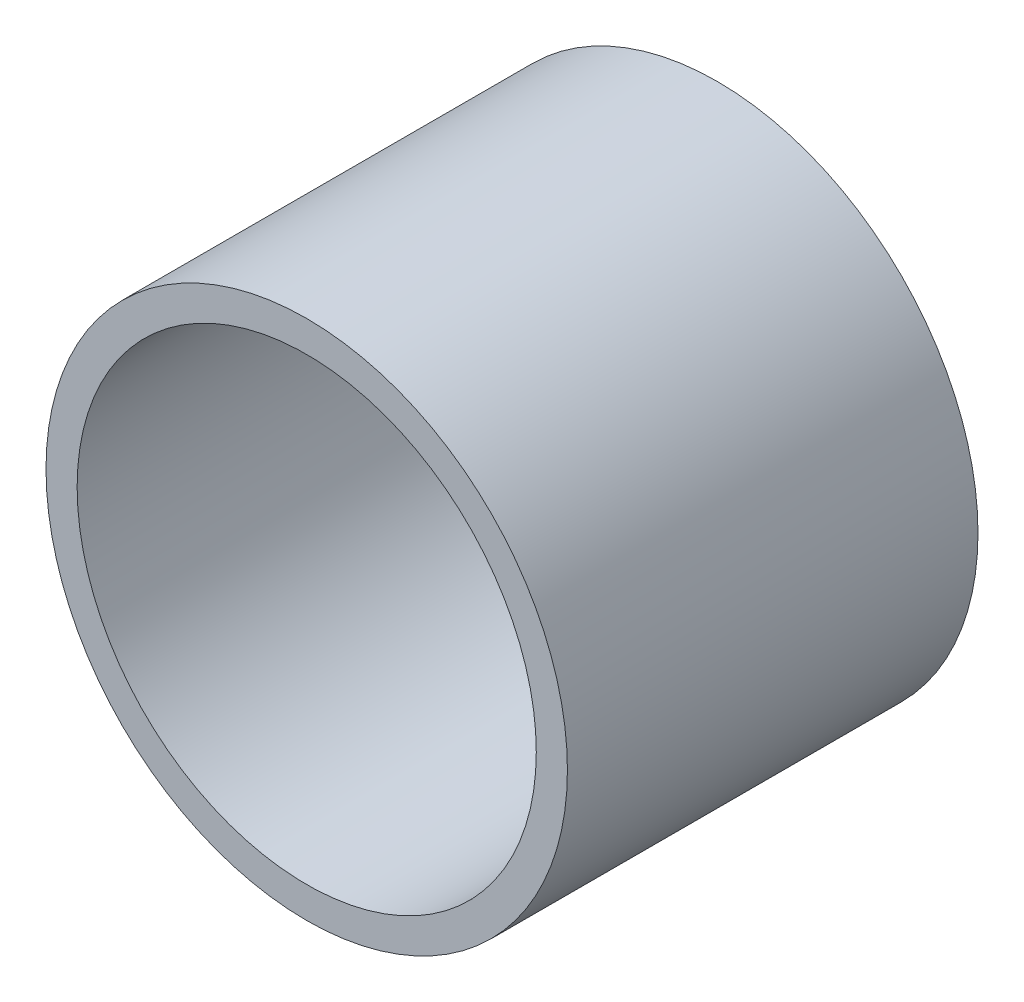
ISO-10303-21;
HEADER;
FILE_DESCRIPTION(('STEP AP214'),'2;1');
FILE_NAME('part.step','',(''),(''),'','','');
FILE_SCHEMA(('AUTOMOTIVE_DESIGN { 1 0 10303 214 1 1 1 1 }'));
ENDSEC;
DATA;
#1=APPLICATION_CONTEXT('core data for automotive mechanical design processes');
#2=APPLICATION_PROTOCOL_DEFINITION('international standard','automotive_design',2000,#1);
#3=PRODUCT_CONTEXT('',#1,'mechanical');
#4=PRODUCT('Part','Part','',(#3));
#5=PRODUCT_RELATED_PRODUCT_CATEGORY('part','',(#4));
#6=PRODUCT_DEFINITION_FORMATION('','',#4);
#7=PRODUCT_DEFINITION_CONTEXT('part definition',#1,'design');
#8=PRODUCT_DEFINITION('design','',#6,#7);
#9=PRODUCT_DEFINITION_SHAPE('','',#8);
#10=(LENGTH_UNIT() NAMED_UNIT(*) SI_UNIT(.MILLI.,.METRE.));
#11=(NAMED_UNIT(*) PLANE_ANGLE_UNIT() SI_UNIT($,.RADIAN.));
#12=(NAMED_UNIT(*) SI_UNIT($,.STERADIAN.) SOLID_ANGLE_UNIT());
#13=UNCERTAINTY_MEASURE_WITH_UNIT(LENGTH_MEASURE(1.E-05),#10,'distance_accuracy_value','');
#14=(GEOMETRIC_REPRESENTATION_CONTEXT(3) GLOBAL_UNCERTAINTY_ASSIGNED_CONTEXT((#13)) GLOBAL_UNIT_ASSIGNED_CONTEXT((#10,
#11,#12)) REPRESENTATION_CONTEXT('',''));
#15=CARTESIAN_POINT('',(0.,0.,0.));
#16=DIRECTION('',(0.,0.,1.));
#17=DIRECTION('',(1.,0.,0.));
#18=AXIS2_PLACEMENT_3D('',#15,#16,#17);
#19=CARTESIAN_POINT('',(0.,0.,90.));
#20=DIRECTION('',(0.,0.,1.));
#21=DIRECTION('',(1.,0.,0.));
#22=AXIS2_PLACEMENT_3D('',#19,#20,#21);
#23=PLANE('',#22);
#24=CARTESIAN_POINT('',(0.,0.,90.));
#25=DIRECTION('',(0.,0.,1.));
#26=DIRECTION('',(1.,0.,0.));
#27=AXIS2_PLACEMENT_3D('',#24,#25,#26);
#28=CIRCLE('',#27,57.15);
#29=CARTESIAN_POINT('',(57.15,0.,90.));
#30=VERTEX_POINT('',#29);
#31=EDGE_CURVE('E10',#30,#30,#28,.T.);
#32=ORIENTED_EDGE('',*,*,#31,.T.);
#33=EDGE_LOOP('',(#32));
#34=FACE_BOUND('',#33,.T.);
#35=CARTESIAN_POINT('',(0.,0.,90.));
#36=DIRECTION('',(0.,0.,1.));
#37=DIRECTION('',(1.,0.,0.));
#38=AXIS2_PLACEMENT_3D('',#35,#36,#37);
#39=CIRCLE('',#38,50.325);
#40=CARTESIAN_POINT('',(50.325,0.,90.));
#41=VERTEX_POINT('',#40);
#42=EDGE_CURVE('E30',#41,#41,#39,.T.);
#43=ORIENTED_EDGE('',*,*,#42,.F.);
#44=EDGE_LOOP('',(#43));
#45=FACE_BOUND('',#44,.T.);
#46=ADVANCED_FACE('F15',(#34,#45),#23,.T.);
#47=CARTESIAN_POINT('',(0.,0.,0.));
#48=DIRECTION('',(0.,0.,1.));
#49=DIRECTION('',(1.,0.,0.));
#50=AXIS2_PLACEMENT_3D('',#47,#48,#49);
#51=PLANE('',#50);
#52=CARTESIAN_POINT('',(0.,0.,0.));
#53=DIRECTION('',(0.,0.,1.));
#54=DIRECTION('',(1.,0.,0.));
#55=AXIS2_PLACEMENT_3D('',#52,#53,#54);
#56=CIRCLE('',#55,57.15);
#57=CARTESIAN_POINT('',(57.15,0.,0.));
#58=VERTEX_POINT('',#57);
#59=EDGE_CURVE('E19',#58,#58,#56,.T.);
#60=ORIENTED_EDGE('',*,*,#59,.F.);
#61=EDGE_LOOP('',(#60));
#62=FACE_BOUND('',#61,.T.);
#63=CARTESIAN_POINT('',(0.,0.,0.));
#64=DIRECTION('',(0.,0.,1.));
#65=DIRECTION('',(1.,0.,0.));
#66=AXIS2_PLACEMENT_3D('',#63,#64,#65);
#67=CIRCLE('',#66,50.325);
#68=CARTESIAN_POINT('',(50.325,0.,0.));
#69=VERTEX_POINT('',#68);
#70=EDGE_CURVE('E32',#69,#69,#67,.T.);
#71=ORIENTED_EDGE('',*,*,#70,.T.);
#72=EDGE_LOOP('',(#71));
#73=FACE_BOUND('',#72,.T.);
#74=ADVANCED_FACE('F45',(#62,#73),#51,.F.);
#75=CARTESIAN_POINT('',(0.,0.,90.));
#76=DIRECTION('',(0.,0.,-1.));
#77=DIRECTION('',(-1.,0.,0.));
#78=AXIS2_PLACEMENT_3D('',#75,#76,#77);
#79=CYLINDRICAL_SURFACE('',#78,57.15);
#80=ORIENTED_EDGE('',*,*,#31,.F.);
#81=EDGE_LOOP('',(#80));
#82=FACE_BOUND('',#81,.T.);
#83=ORIENTED_EDGE('',*,*,#59,.T.);
#84=EDGE_LOOP('',(#83));
#85=FACE_BOUND('',#84,.T.);
#86=ADVANCED_FACE('F17',(#82,#85),#79,.T.);
#87=CARTESIAN_POINT('',(0.,0.,90.));
#88=DIRECTION('',(0.,0.,-1.));
#89=DIRECTION('',(-1.,0.,0.));
#90=AXIS2_PLACEMENT_3D('',#87,#88,#89);
#91=CYLINDRICAL_SURFACE('',#90,50.325);
#92=ORIENTED_EDGE('',*,*,#42,.T.);
#93=EDGE_LOOP('',(#92));
#94=FACE_BOUND('',#93,.T.);
#95=ORIENTED_EDGE('',*,*,#70,.F.);
#96=EDGE_LOOP('',(#95));
#97=FACE_BOUND('',#96,.T.);
#98=ADVANCED_FACE('F41',(#94,#97),#91,.F.);
#99=CLOSED_SHELL('',(#46,#74,#86,#98));
#100=MANIFOLD_SOLID_BREP('B1',#99);
#101=ADVANCED_BREP_SHAPE_REPRESENTATION('',(#18,#100),#14);
#102=SHAPE_DEFINITION_REPRESENTATION(#9,#101);
ENDSEC;
END-ISO-10303-21;
